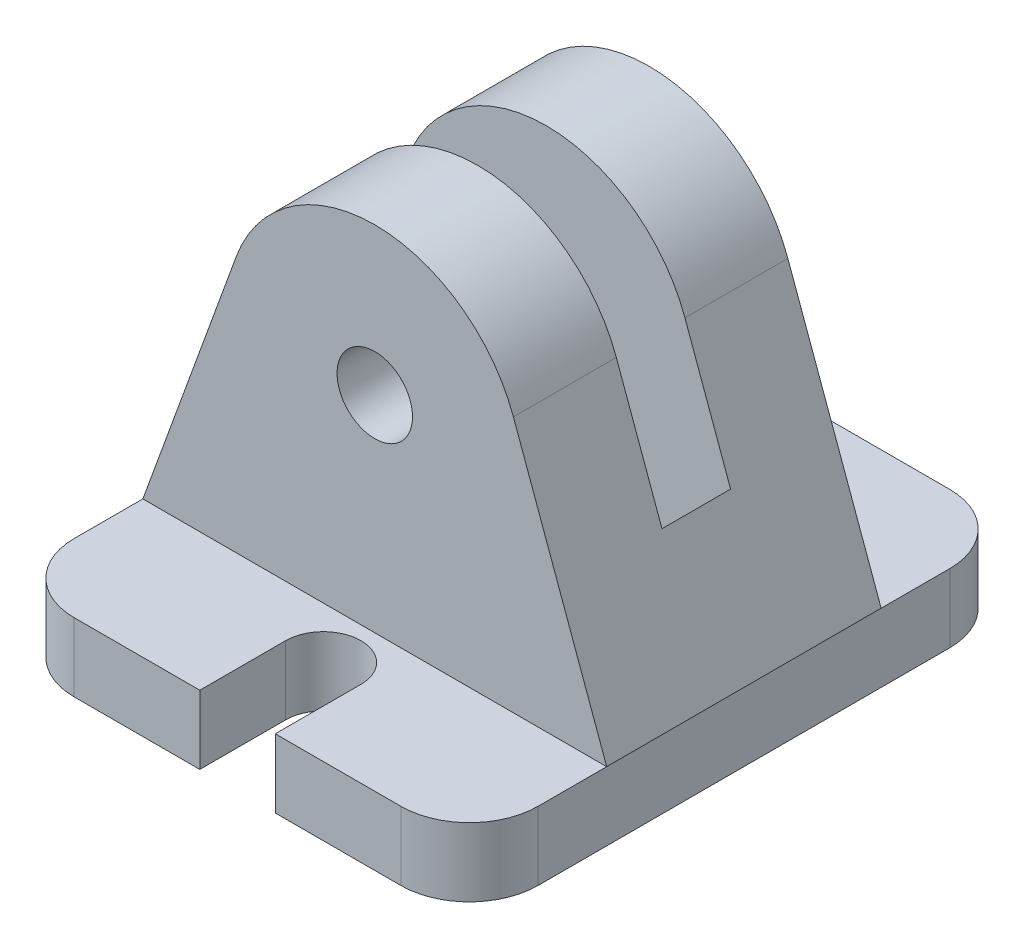
ISO-10303-21;
HEADER;
FILE_DESCRIPTION(('STEP AP214'),'2;1');
FILE_NAME('part.step','',(''),(''),'','','');
FILE_SCHEMA(('AUTOMOTIVE_DESIGN { 1 0 10303 214 1 1 1 1 }'));
ENDSEC;
DATA;
#1=APPLICATION_CONTEXT('core data for automotive mechanical design processes');
#2=APPLICATION_PROTOCOL_DEFINITION('international standard','automotive_design',2000,#1);
#3=PRODUCT_CONTEXT('',#1,'mechanical');
#4=PRODUCT('Part','Part','',(#3));
#5=PRODUCT_RELATED_PRODUCT_CATEGORY('part','',(#4));
#6=PRODUCT_DEFINITION_FORMATION('','',#4);
#7=PRODUCT_DEFINITION_CONTEXT('part definition',#1,'design');
#8=PRODUCT_DEFINITION('design','',#6,#7);
#9=PRODUCT_DEFINITION_SHAPE('','',#8);
#10=(LENGTH_UNIT() NAMED_UNIT(*) SI_UNIT(.MILLI.,.METRE.));
#11=(NAMED_UNIT(*) PLANE_ANGLE_UNIT() SI_UNIT($,.RADIAN.));
#12=(NAMED_UNIT(*) SI_UNIT($,.STERADIAN.) SOLID_ANGLE_UNIT());
#13=UNCERTAINTY_MEASURE_WITH_UNIT(LENGTH_MEASURE(1.E-05),#10,'distance_accuracy_value','');
#14=(GEOMETRIC_REPRESENTATION_CONTEXT(3) GLOBAL_UNCERTAINTY_ASSIGNED_CONTEXT((#13)) GLOBAL_UNIT_ASSIGNED_CONTEXT((#10,
#11,#12)) REPRESENTATION_CONTEXT('',''));
#15=CARTESIAN_POINT('',(0.,0.,0.));
#16=DIRECTION('',(0.,0.,1.));
#17=DIRECTION('',(1.,0.,0.));
#18=AXIS2_PLACEMENT_3D('',#15,#16,#17);
#19=CARTESIAN_POINT('',(0.,-20.,-20.));
#20=DIRECTION('',(0.,0.,1.));
#21=DIRECTION('',(1.,0.,0.));
#22=AXIS2_PLACEMENT_3D('',#19,#20,#21);
#23=PLANE('',#22);
#24=DIRECTION('',(1.,0.,0.));
#25=VECTOR('',#24,1.);
#26=CARTESIAN_POINT('',(0.,-20.,-20.));
#27=LINE('',#26,#25);
#28=CARTESIAN_POINT('',(2.75,-20.,-20.));
#29=VERTEX_POINT('',#28);
#30=CARTESIAN_POINT('',(11.8994645681091,-20.,-20.));
#31=VERTEX_POINT('',#30);
#32=EDGE_CURVE('E220',#29,#31,#27,.T.);
#33=ORIENTED_EDGE('',*,*,#32,.F.);
#34=DIRECTION('',(0.,-1.,0.));
#35=VECTOR('',#34,1.);
#36=CARTESIAN_POINT('',(2.75,10.75,-20.));
#37=LINE('',#36,#35);
#38=CARTESIAN_POINT('',(2.75,-15.,-20.));
#39=VERTEX_POINT('',#38);
#40=EDGE_CURVE('E211',#39,#29,#37,.T.);
#41=ORIENTED_EDGE('',*,*,#40,.F.);
#42=DIRECTION('',(1.,0.,0.));
#43=VECTOR('',#42,1.);
#44=CARTESIAN_POINT('',(0.,-15.,-20.));
#45=LINE('',#44,#43);
#46=CARTESIAN_POINT('',(11.8994645681091,-15.,-20.));
#47=VERTEX_POINT('',#46);
#48=EDGE_CURVE('E480',#39,#47,#45,.T.);
#49=ORIENTED_EDGE('',*,*,#48,.T.);
#50=DIRECTION('',(0.,1.,0.));
#51=VECTOR('',#50,1.);
#52=CARTESIAN_POINT('',(11.8994645681091,-20.,-20.));
#53=LINE('',#52,#51);
#54=EDGE_CURVE('E280',#31,#47,#53,.T.);
#55=ORIENTED_EDGE('',*,*,#54,.F.);
#56=EDGE_LOOP('',(#33,#41,#49,#55));
#57=FACE_BOUND('',#56,.T.);
#58=ADVANCED_FACE('F32',(#57),#23,.F.);
#59=CARTESIAN_POINT('',(0.,-20.,20.));
#60=DIRECTION('',(0.,0.,1.));
#61=DIRECTION('',(1.,0.,0.));
#62=AXIS2_PLACEMENT_3D('',#59,#60,#61);
#63=PLANE('',#62);
#64=DIRECTION('',(0.,-1.,0.));
#65=VECTOR('',#64,1.);
#66=CARTESIAN_POINT('',(2.75,10.75,20.));
#67=LINE('',#66,#65);
#68=CARTESIAN_POINT('',(2.75,-15.,20.));
#69=VERTEX_POINT('',#68);
#70=CARTESIAN_POINT('',(2.75,-20.,20.));
#71=VERTEX_POINT('',#70);
#72=EDGE_CURVE('E240',#69,#71,#67,.T.);
#73=ORIENTED_EDGE('',*,*,#72,.T.);
#74=DIRECTION('',(1.,0.,0.));
#75=VECTOR('',#74,1.);
#76=CARTESIAN_POINT('',(0.,-20.,20.));
#77=LINE('',#76,#75);
#78=CARTESIAN_POINT('',(11.8994645681091,-20.,20.));
#79=VERTEX_POINT('',#78);
#80=EDGE_CURVE('E231',#71,#79,#77,.T.);
#81=ORIENTED_EDGE('',*,*,#80,.T.);
#82=DIRECTION('',(0.,1.,0.));
#83=VECTOR('',#82,1.);
#84=CARTESIAN_POINT('',(11.8994645681091,-20.,20.));
#85=LINE('',#84,#83);
#86=CARTESIAN_POINT('',(11.8994645681091,-15.,20.));
#87=VERTEX_POINT('',#86);
#88=EDGE_CURVE('E271',#79,#87,#85,.T.);
#89=ORIENTED_EDGE('',*,*,#88,.T.);
#90=DIRECTION('',(1.,0.,0.));
#91=VECTOR('',#90,1.);
#92=CARTESIAN_POINT('',(0.,-15.,20.));
#93=LINE('',#92,#91);
#94=EDGE_CURVE('E265',#69,#87,#93,.T.);
#95=ORIENTED_EDGE('',*,*,#94,.F.);
#96=EDGE_LOOP('',(#73,#81,#89,#95));
#97=FACE_BOUND('',#96,.T.);
#98=ADVANCED_FACE('F457',(#97),#63,.T.);
#99=CARTESIAN_POINT('',(0.,0.,10.));
#100=DIRECTION('',(0.,0.,-1.));
#101=DIRECTION('',(-1.,0.,0.));
#102=AXIS2_PLACEMENT_3D('',#99,#100,#101);
#103=CYLINDRICAL_SURFACE('',#102,10.75);
#104=CARTESIAN_POINT('',(0.,0.,-2.5));
#105=DIRECTION('',(0.,0.,1.));
#106=DIRECTION('',(1.,0.,0.));
#107=AXIS2_PLACEMENT_3D('',#104,#105,#106);
#108=CIRCLE('',#107,10.75);
#109=CARTESIAN_POINT('',(10.1016956734485,3.67671654075095,-2.5));
#110=VERTEX_POINT('',#109);
#111=CARTESIAN_POINT('',(-10.1016956734485,3.67671654075095,-2.5));
#112=VERTEX_POINT('',#111);
#113=EDGE_CURVE('E314',#110,#112,#108,.T.);
#114=ORIENTED_EDGE('',*,*,#113,.F.);
#115=DIRECTION('',(0.,0.,-1.));
#116=VECTOR('',#115,1.);
#117=CARTESIAN_POINT('',(10.1016956734485,3.67671654075095,10.));
#118=LINE('',#117,#116);
#119=CARTESIAN_POINT('',(10.1016956734485,3.67671654075095,-10.));
#120=VERTEX_POINT('',#119);
#121=EDGE_CURVE('E352',#110,#120,#118,.T.);
#122=ORIENTED_EDGE('',*,*,#121,.T.);
#123=CARTESIAN_POINT('',(0.,0.,-10.));
#124=DIRECTION('',(0.,0.,1.));
#125=DIRECTION('',(1.,0.,0.));
#126=AXIS2_PLACEMENT_3D('',#123,#124,#125);
#127=CIRCLE('',#126,10.75);
#128=CARTESIAN_POINT('',(-10.1016956734485,3.67671654075095,-10.));
#129=VERTEX_POINT('',#128);
#130=EDGE_CURVE('E325',#120,#129,#127,.T.);
#131=ORIENTED_EDGE('',*,*,#130,.T.);
#132=DIRECTION('',(0.,0.,-1.));
#133=VECTOR('',#132,1.);
#134=CARTESIAN_POINT('',(-10.1016956734485,3.67671654075095,10.));
#135=LINE('',#134,#133);
#136=EDGE_CURVE('E360',#112,#129,#135,.T.);
#137=ORIENTED_EDGE('',*,*,#136,.F.);
#138=EDGE_LOOP('',(#114,#122,#131,#137));
#139=FACE_BOUND('',#138,.T.);
#140=ADVANCED_FACE('F498',(#139),#103,.T.);
#141=CARTESIAN_POINT('',(-10.1016956734485,3.67671654075095,10.));
#142=DIRECTION('',(0.939692620785908,-0.342020143325669,0.));
#143=DIRECTION('',(0.342020143325669,0.939692620785908,0.));
#144=AXIS2_PLACEMENT_3D('',#141,#142,#143);
#145=PLANE('',#144);
#146=DIRECTION('',(-0.342020143325669,-0.939692620785908,0.));
#147=VECTOR('',#146,1.);
#148=CARTESIAN_POINT('',(-10.1016956734485,3.67671654075095,-2.5));
#149=LINE('',#148,#147);
#150=CARTESIAN_POINT('',(-13.4298082611002,-5.46719764322487,-2.5));
#151=VERTEX_POINT('',#150);
#152=EDGE_CURVE('E316',#112,#151,#149,.T.);
#153=ORIENTED_EDGE('',*,*,#152,.F.);
#154=ORIENTED_EDGE('',*,*,#136,.T.);
#155=DIRECTION('',(-0.342020143325669,-0.939692620785908,0.));
#156=VECTOR('',#155,1.);
#157=CARTESIAN_POINT('',(-10.1016956734485,3.67671654075095,-10.));
#158=LINE('',#157,#156);
#159=CARTESIAN_POINT('',(-16.8994645681091,-15.,-10.));
#160=VERTEX_POINT('',#159);
#161=EDGE_CURVE('E363',#129,#160,#158,.T.);
#162=ORIENTED_EDGE('',*,*,#161,.T.);
#163=DIRECTION('',(0.,0.,-1.));
#164=VECTOR('',#163,1.);
#165=CARTESIAN_POINT('',(-16.8994645681091,-15.,10.));
#166=LINE('',#165,#164);
#167=CARTESIAN_POINT('',(-16.8994645681091,-15.,10.));
#168=VERTEX_POINT('',#167);
#169=EDGE_CURVE('E347',#168,#160,#166,.T.);
#170=ORIENTED_EDGE('',*,*,#169,.F.);
#171=DIRECTION('',(-0.342020143325669,-0.939692620785908,0.));
#172=VECTOR('',#171,1.);
#173=CARTESIAN_POINT('',(-10.1016956734485,3.67671654075095,10.));
#174=LINE('',#173,#172);
#175=CARTESIAN_POINT('',(-10.1016956734485,3.67671654075095,10.));
#176=VERTEX_POINT('',#175);
#177=EDGE_CURVE('E331',#176,#168,#174,.T.);
#178=ORIENTED_EDGE('',*,*,#177,.F.);
#179=CARTESIAN_POINT('',(-10.1016956734485,3.67671654075095,2.5));
#180=VERTEX_POINT('',#179);
#181=EDGE_CURVE('E375',#176,#180,#135,.T.);
#182=ORIENTED_EDGE('',*,*,#181,.T.);
#183=DIRECTION('',(-0.342020143325669,-0.939692620785908,0.));
#184=VECTOR('',#183,1.);
#185=CARTESIAN_POINT('',(-10.1016956734485,3.67671654075095,2.5));
#186=LINE('',#185,#184);
#187=CARTESIAN_POINT('',(-13.4298082611002,-5.46719764322487,2.5));
#188=VERTEX_POINT('',#187);
#189=EDGE_CURVE('E308',#180,#188,#186,.T.);
#190=ORIENTED_EDGE('',*,*,#189,.T.);
#191=DIRECTION('',(0.,0.,1.));
#192=VECTOR('',#191,1.);
#193=CARTESIAN_POINT('',(-13.4298082611002,-5.46719764322487,-2.5));
#194=LINE('',#193,#192);
#195=EDGE_CURVE('E318',#188,#151,#194,.F.);
#196=ORIENTED_EDGE('',*,*,#195,.T.);
#197=EDGE_LOOP('',(#153,#154,#162,#170,#178,#182,#190,#196));
#198=FACE_BOUND('',#197,.T.);
#199=ADVANCED_FACE('F396',(#198),#145,.F.);
#200=CARTESIAN_POINT('',(16.8994645681091,-15.,10.));
#201=DIRECTION('',(-0.939692620785908,-0.34202014332567,0.));
#202=DIRECTION('',(0.34202014332567,-0.939692620785908,0.));
#203=AXIS2_PLACEMENT_3D('',#200,#201,#202);
#204=PLANE('',#203);
#205=DIRECTION('',(-0.34202014332567,0.939692620785908,0.));
#206=VECTOR('',#205,1.);
#207=CARTESIAN_POINT('',(16.8994645681091,-15.,-2.5));
#208=LINE('',#207,#206);
#209=CARTESIAN_POINT('',(13.4298082611003,-5.46719764322486,-2.5));
#210=VERTEX_POINT('',#209);
#211=EDGE_CURVE('E312',#210,#110,#208,.T.);
#212=ORIENTED_EDGE('',*,*,#211,.F.);
#213=DIRECTION('',(0.,0.,1.));
#214=VECTOR('',#213,1.);
#215=CARTESIAN_POINT('',(13.4298082611003,-5.46719764322486,-2.5));
#216=LINE('',#215,#214);
#217=CARTESIAN_POINT('',(13.4298082611003,-5.46719764322486,2.5));
#218=VERTEX_POINT('',#217);
#219=EDGE_CURVE('E342',#210,#218,#216,.T.);
#220=ORIENTED_EDGE('',*,*,#219,.T.);
#221=DIRECTION('',(-0.34202014332567,0.939692620785908,0.));
#222=VECTOR('',#221,1.);
#223=CARTESIAN_POINT('',(16.8994645681091,-15.,2.5));
#224=LINE('',#223,#222);
#225=CARTESIAN_POINT('',(10.1016956734485,3.67671654075095,2.5));
#226=VERTEX_POINT('',#225);
#227=EDGE_CURVE('E302',#218,#226,#224,.T.);
#228=ORIENTED_EDGE('',*,*,#227,.T.);
#229=CARTESIAN_POINT('',(10.1016956734485,3.67671654075095,10.));
#230=VERTEX_POINT('',#229);
#231=EDGE_CURVE('E348',#230,#226,#118,.T.);
#232=ORIENTED_EDGE('',*,*,#231,.F.);
#233=DIRECTION('',(-0.34202014332567,0.939692620785908,0.));
#234=VECTOR('',#233,1.);
#235=CARTESIAN_POINT('',(16.8994645681091,-15.,10.));
#236=LINE('',#235,#234);
#237=CARTESIAN_POINT('',(16.8994645681091,-15.,10.));
#238=VERTEX_POINT('',#237);
#239=EDGE_CURVE('E341',#238,#230,#236,.T.);
#240=ORIENTED_EDGE('',*,*,#239,.F.);
#241=DIRECTION('',(0.,0.,-1.));
#242=VECTOR('',#241,1.);
#243=CARTESIAN_POINT('',(16.8994645681091,-15.,10.));
#244=LINE('',#243,#242);
#245=CARTESIAN_POINT('',(16.8994645681091,-15.,-10.));
#246=VERTEX_POINT('',#245);
#247=EDGE_CURVE('E344',#238,#246,#244,.T.);
#248=ORIENTED_EDGE('',*,*,#247,.T.);
#249=DIRECTION('',(-0.34202014332567,0.939692620785908,0.));
#250=VECTOR('',#249,1.);
#251=CARTESIAN_POINT('',(16.8994645681091,-15.,-10.));
#252=LINE('',#251,#250);
#253=EDGE_CURVE('E332',#246,#120,#252,.T.);
#254=ORIENTED_EDGE('',*,*,#253,.T.);
#255=ORIENTED_EDGE('',*,*,#121,.F.);
#256=EDGE_LOOP('',(#212,#220,#228,#232,#240,#248,#254,#255));
#257=FACE_BOUND('',#256,.T.);
#258=ADVANCED_FACE('F404',(#257),#204,.F.);
#259=CARTESIAN_POINT('',(0.,0.,10.));
#260=DIRECTION('',(0.,0.,-1.));
#261=DIRECTION('',(-1.,0.,0.));
#262=AXIS2_PLACEMENT_3D('',#259,#260,#261);
#263=CYLINDRICAL_SURFACE('',#262,2.75);
#264=CARTESIAN_POINT('',(0.,0.,-10.));
#265=DIRECTION('',(0.,0.,1.));
#266=DIRECTION('',(1.,0.,0.));
#267=AXIS2_PLACEMENT_3D('',#264,#265,#266);
#268=CIRCLE('',#267,2.75);
#269=CARTESIAN_POINT('',(2.75,0.,-10.));
#270=VERTEX_POINT('',#269);
#271=EDGE_CURVE('E321',#270,#270,#268,.T.);
#272=ORIENTED_EDGE('',*,*,#271,.F.);
#273=EDGE_LOOP('',(#272));
#274=FACE_BOUND('',#273,.T.);
#275=CARTESIAN_POINT('',(0.,0.,-2.5));
#276=DIRECTION('',(0.,0.,1.));
#277=DIRECTION('',(1.,0.,0.));
#278=AXIS2_PLACEMENT_3D('',#275,#276,#277);
#279=CIRCLE('',#278,2.75);
#280=CARTESIAN_POINT('',(2.75,0.,-2.5));
#281=VERTEX_POINT('',#280);
#282=EDGE_CURVE('E311',#281,#281,#279,.T.);
#283=ORIENTED_EDGE('',*,*,#282,.T.);
#284=EDGE_LOOP('',(#283));
#285=FACE_BOUND('',#284,.T.);
#286=ADVANCED_FACE('F382',(#274,#285),#263,.F.);
#287=CARTESIAN_POINT('',(0.,0.,10.));
#288=DIRECTION('',(0.,0.,1.));
#289=DIRECTION('',(1.,0.,0.));
#290=AXIS2_PLACEMENT_3D('',#287,#288,#289);
#291=PLANE('',#290);
#292=CARTESIAN_POINT('',(0.,0.,10.));
#293=DIRECTION('',(0.,0.,1.));
#294=DIRECTION('',(1.,0.,0.));
#295=AXIS2_PLACEMENT_3D('',#292,#293,#294);
#296=CIRCLE('',#295,10.75);
#297=EDGE_CURVE('E328',#230,#176,#296,.T.);
#298=ORIENTED_EDGE('',*,*,#297,.T.);
#299=ORIENTED_EDGE('',*,*,#177,.T.);
#300=DIRECTION('',(1.,0.,0.));
#301=VECTOR('',#300,1.);
#302=CARTESIAN_POINT('',(-16.8994645681091,-15.,10.));
#303=LINE('',#302,#301);
#304=EDGE_CURVE('E337',#168,#238,#303,.T.);
#305=ORIENTED_EDGE('',*,*,#304,.T.);
#306=ORIENTED_EDGE('',*,*,#239,.T.);
#307=EDGE_LOOP('',(#298,#299,#305,#306));
#308=FACE_BOUND('',#307,.T.);
#309=CARTESIAN_POINT('',(0.,0.,10.));
#310=DIRECTION('',(0.,0.,1.));
#311=DIRECTION('',(1.,0.,0.));
#312=AXIS2_PLACEMENT_3D('',#309,#310,#311);
#313=CIRCLE('',#312,2.75);
#314=CARTESIAN_POINT('',(2.75,0.,10.));
#315=VERTEX_POINT('',#314);
#316=EDGE_CURVE('E322',#315,#315,#313,.T.);
#317=ORIENTED_EDGE('',*,*,#316,.F.);
#318=EDGE_LOOP('',(#317));
#319=FACE_BOUND('',#318,.T.);
#320=ADVANCED_FACE('F468',(#308,#319),#291,.T.);
#321=CARTESIAN_POINT('',(0.,0.,-10.));
#322=DIRECTION('',(0.,0.,1.));
#323=DIRECTION('',(1.,0.,0.));
#324=AXIS2_PLACEMENT_3D('',#321,#322,#323);
#325=PLANE('',#324);
#326=ORIENTED_EDGE('',*,*,#130,.F.);
#327=ORIENTED_EDGE('',*,*,#253,.F.);
#328=DIRECTION('',(1.,0.,0.));
#329=VECTOR('',#328,1.);
#330=CARTESIAN_POINT('',(-16.8994645681091,-15.,-10.));
#331=LINE('',#330,#329);
#332=EDGE_CURVE('E366',#160,#246,#331,.T.);
#333=ORIENTED_EDGE('',*,*,#332,.F.);
#334=ORIENTED_EDGE('',*,*,#161,.F.);
#335=EDGE_LOOP('',(#326,#327,#333,#334));
#336=FACE_BOUND('',#335,.T.);
#337=ORIENTED_EDGE('',*,*,#271,.T.);
#338=EDGE_LOOP('',(#337));
#339=FACE_BOUND('',#338,.T.);
#340=ADVANCED_FACE('F494',(#336,#339),#325,.F.);
#341=ORIENTED_EDGE('',*,*,#231,.T.);
#342=CARTESIAN_POINT('',(0.,0.,2.5));
#343=DIRECTION('',(0.,0.,1.));
#344=DIRECTION('',(1.,0.,0.));
#345=AXIS2_PLACEMENT_3D('',#342,#343,#344);
#346=CIRCLE('',#345,10.75);
#347=EDGE_CURVE('E305',#226,#180,#346,.T.);
#348=ORIENTED_EDGE('',*,*,#347,.T.);
#349=ORIENTED_EDGE('',*,*,#181,.F.);
#350=ORIENTED_EDGE('',*,*,#297,.F.);
#351=EDGE_LOOP('',(#341,#348,#349,#350));
#352=FACE_BOUND('',#351,.T.);
#353=ADVANCED_FACE('F34',(#352),#103,.T.);
#354=CARTESIAN_POINT('',(0.,0.,2.5));
#355=DIRECTION('',(0.,0.,1.));
#356=DIRECTION('',(1.,0.,0.));
#357=AXIS2_PLACEMENT_3D('',#354,#355,#356);
#358=CIRCLE('',#357,2.75);
#359=CARTESIAN_POINT('',(2.75,0.,2.5));
#360=VERTEX_POINT('',#359);
#361=EDGE_CURVE('E300',#360,#360,#358,.T.);
#362=ORIENTED_EDGE('',*,*,#361,.F.);
#363=EDGE_LOOP('',(#362));
#364=FACE_BOUND('',#363,.T.);
#365=ORIENTED_EDGE('',*,*,#316,.T.);
#366=EDGE_LOOP('',(#365));
#367=FACE_BOUND('',#366,.T.);
#368=ADVANCED_FACE('F506',(#364,#367),#263,.F.);
#369=CARTESIAN_POINT('',(0.,0.,-2.5));
#370=DIRECTION('',(0.,0.,1.));
#371=DIRECTION('',(1.,0.,0.));
#372=AXIS2_PLACEMENT_3D('',#369,#370,#371);
#373=CYLINDRICAL_SURFACE('',#372,14.5);
#374=CARTESIAN_POINT('',(0.,0.,2.5));
#375=DIRECTION('',(0.,0.,1.));
#376=DIRECTION('',(1.,0.,0.));
#377=AXIS2_PLACEMENT_3D('',#374,#375,#376);
#378=CIRCLE('',#377,14.5);
#379=EDGE_CURVE('E288',#188,#218,#378,.T.);
#380=ORIENTED_EDGE('',*,*,#379,.T.);
#381=ORIENTED_EDGE('',*,*,#219,.F.);
#382=CARTESIAN_POINT('',(0.,0.,-2.5));
#383=DIRECTION('',(0.,0.,1.));
#384=DIRECTION('',(1.,0.,0.));
#385=AXIS2_PLACEMENT_3D('',#382,#383,#384);
#386=CIRCLE('',#385,14.5);
#387=EDGE_CURVE('E294',#151,#210,#386,.T.);
#388=ORIENTED_EDGE('',*,*,#387,.F.);
#389=ORIENTED_EDGE('',*,*,#195,.F.);
#390=EDGE_LOOP('',(#380,#381,#388,#389));
#391=FACE_BOUND('',#390,.T.);
#392=ADVANCED_FACE('F388',(#391),#373,.F.);
#393=CARTESIAN_POINT('',(0.,0.,-2.5));
#394=DIRECTION('',(0.,0.,1.));
#395=DIRECTION('',(1.,0.,0.));
#396=AXIS2_PLACEMENT_3D('',#393,#394,#395);
#397=PLANE('',#396);
#398=ORIENTED_EDGE('',*,*,#282,.F.);
#399=EDGE_LOOP('',(#398));
#400=FACE_BOUND('',#399,.T.);
#401=ORIENTED_EDGE('',*,*,#152,.T.);
#402=ORIENTED_EDGE('',*,*,#387,.T.);
#403=ORIENTED_EDGE('',*,*,#211,.T.);
#404=ORIENTED_EDGE('',*,*,#113,.T.);
#405=EDGE_LOOP('',(#401,#402,#403,#404));
#406=FACE_BOUND('',#405,.T.);
#407=ADVANCED_FACE('F384',(#400,#406),#397,.T.);
#408=CARTESIAN_POINT('',(0.,0.,2.5));
#409=DIRECTION('',(0.,0.,1.));
#410=DIRECTION('',(1.,0.,0.));
#411=AXIS2_PLACEMENT_3D('',#408,#409,#410);
#412=PLANE('',#411);
#413=ORIENTED_EDGE('',*,*,#361,.T.);
#414=EDGE_LOOP('',(#413));
#415=FACE_BOUND('',#414,.T.);
#416=ORIENTED_EDGE('',*,*,#347,.F.);
#417=ORIENTED_EDGE('',*,*,#227,.F.);
#418=ORIENTED_EDGE('',*,*,#379,.F.);
#419=ORIENTED_EDGE('',*,*,#189,.F.);
#420=EDGE_LOOP('',(#416,#417,#418,#419));
#421=FACE_BOUND('',#420,.T.);
#422=ADVANCED_FACE('F387',(#415,#421),#412,.F.);
#423=CARTESIAN_POINT('',(0.,-15.,0.));
#424=DIRECTION('',(0.,-1.,0.));
#425=DIRECTION('',(1.,0.,0.));
#426=AXIS2_PLACEMENT_3D('',#423,#424,#425);
#427=PLANE('',#426);
#428=ORIENTED_EDGE('',*,*,#48,.F.);
#429=DIRECTION('',(0.,0.,1.));
#430=VECTOR('',#429,1.);
#431=CARTESIAN_POINT('',(2.75,-15.,0.));
#432=LINE('',#431,#430);
#433=CARTESIAN_POINT('',(2.75,-15.,-13.75));
#434=VERTEX_POINT('',#433);
#435=EDGE_CURVE('E451',#39,#434,#432,.T.);
#436=ORIENTED_EDGE('',*,*,#435,.T.);
#437=CARTESIAN_POINT('',(0.,-15.,-13.75));
#438=DIRECTION('',(0.,-1.,0.));
#439=DIRECTION('',(1.,0.,0.));
#440=AXIS2_PLACEMENT_3D('',#437,#438,#439);
#441=CIRCLE('',#440,2.75);
#442=CARTESIAN_POINT('',(-2.75,-15.,-13.75));
#443=VERTEX_POINT('',#442);
#444=EDGE_CURVE('E447',#434,#443,#441,.T.);
#445=ORIENTED_EDGE('',*,*,#444,.T.);
#446=DIRECTION('',(0.,0.,-1.));
#447=VECTOR('',#446,1.);
#448=CARTESIAN_POINT('',(-2.75,-15.,0.));
#449=LINE('',#448,#447);
#450=CARTESIAN_POINT('',(-2.75,-15.,-20.));
#451=VERTEX_POINT('',#450);
#452=EDGE_CURVE('E737',#443,#451,#449,.T.);
#453=ORIENTED_EDGE('',*,*,#452,.T.);
#454=CARTESIAN_POINT('',(-11.8994645681091,-15.,-20.));
#455=VERTEX_POINT('',#454);
#456=EDGE_CURVE('E210',#455,#451,#45,.T.);
#457=ORIENTED_EDGE('',*,*,#456,.F.);
#458=CARTESIAN_POINT('',(-11.8994645681091,-15.,-15.));
#459=DIRECTION('',(0.,-1.,0.));
#460=DIRECTION('',(1.,0.,0.));
#461=AXIS2_PLACEMENT_3D('',#458,#459,#460);
#462=CIRCLE('',#461,5.);
#463=CARTESIAN_POINT('',(-16.8994645681091,-15.,-15.));
#464=VERTEX_POINT('',#463);
#465=EDGE_CURVE('E243',#464,#455,#462,.T.);
#466=ORIENTED_EDGE('',*,*,#465,.F.);
#467=DIRECTION('',(0.,0.,1.));
#468=VECTOR('',#467,1.);
#469=CARTESIAN_POINT('',(-16.8994645681091,-15.,0.));
#470=LINE('',#469,#468);
#471=EDGE_CURVE('E249',#464,#160,#470,.T.);
#472=ORIENTED_EDGE('',*,*,#471,.T.);
#473=ORIENTED_EDGE('',*,*,#332,.T.);
#474=DIRECTION('',(0.,0.,1.));
#475=VECTOR('',#474,1.);
#476=CARTESIAN_POINT('',(16.8994645681091,-15.,0.));
#477=LINE('',#476,#475);
#478=CARTESIAN_POINT('',(16.8994645681091,-15.,-15.));
#479=VERTEX_POINT('',#478);
#480=EDGE_CURVE('E255',#479,#246,#477,.T.);
#481=ORIENTED_EDGE('',*,*,#480,.F.);
#482=CARTESIAN_POINT('',(11.8994645681091,-15.,-15.));
#483=DIRECTION('',(0.,-1.,0.));
#484=DIRECTION('',(1.,0.,0.));
#485=AXIS2_PLACEMENT_3D('',#482,#483,#484);
#486=CIRCLE('',#485,5.);
#487=EDGE_CURVE('E256',#47,#479,#486,.T.);
#488=ORIENTED_EDGE('',*,*,#487,.F.);
#489=EDGE_LOOP('',(#428,#436,#445,#453,#457,#466,#472,#473,#481,#488));
#490=FACE_BOUND('',#489,.T.);
#491=ADVANCED_FACE('F476',(#490),#427,.F.);
#492=CARTESIAN_POINT('',(-11.8994645681091,-20.,15.));
#493=DIRECTION('',(0.,1.,0.));
#494=DIRECTION('',(-1.,0.,0.));
#495=AXIS2_PLACEMENT_3D('',#492,#493,#494);
#496=CYLINDRICAL_SURFACE('',#495,5.);
#497=CARTESIAN_POINT('',(-11.8994645681091,-15.,15.));
#498=DIRECTION('',(0.,-1.,0.));
#499=DIRECTION('',(1.,0.,0.));
#500=AXIS2_PLACEMENT_3D('',#497,#498,#499);
#501=CIRCLE('',#500,5.);
#502=CARTESIAN_POINT('',(-16.8994645681091,-15.,15.));
#503=VERTEX_POINT('',#502);
#504=CARTESIAN_POINT('',(-11.8994645681091,-15.,20.));
#505=VERTEX_POINT('',#504);
#506=EDGE_CURVE('E236',#503,#505,#501,.F.);
#507=ORIENTED_EDGE('',*,*,#506,.F.);
#508=DIRECTION('',(0.,1.,0.));
#509=VECTOR('',#508,1.);
#510=CARTESIAN_POINT('',(-16.8994645681091,-20.,15.));
#511=LINE('',#510,#509);
#512=CARTESIAN_POINT('',(-16.8994645681091,-20.,15.));
#513=VERTEX_POINT('',#512);
#514=EDGE_CURVE('E286',#513,#503,#511,.T.);
#515=ORIENTED_EDGE('',*,*,#514,.F.);
#516=CARTESIAN_POINT('',(-11.8994645681091,-20.,15.));
#517=DIRECTION('',(0.,-1.,0.));
#518=DIRECTION('',(1.,0.,0.));
#519=AXIS2_PLACEMENT_3D('',#516,#517,#518);
#520=CIRCLE('',#519,5.);
#521=CARTESIAN_POINT('',(-11.8994645681091,-20.,20.));
#522=VERTEX_POINT('',#521);
#523=EDGE_CURVE('E269',#513,#522,#520,.F.);
#524=ORIENTED_EDGE('',*,*,#523,.T.);
#525=DIRECTION('',(0.,1.,0.));
#526=VECTOR('',#525,1.);
#527=CARTESIAN_POINT('',(-11.8994645681091,-20.,20.));
#528=LINE('',#527,#526);
#529=EDGE_CURVE('E235',#522,#505,#528,.T.);
#530=ORIENTED_EDGE('',*,*,#529,.T.);
#531=EDGE_LOOP('',(#507,#515,#524,#530));
#532=FACE_BOUND('',#531,.T.);
#533=ADVANCED_FACE('F440',(#532),#496,.T.);
#534=CARTESIAN_POINT('',(-16.8994645681091,-20.,0.));
#535=DIRECTION('',(-1.,0.,0.));
#536=DIRECTION('',(0.,-1.,0.));
#537=AXIS2_PLACEMENT_3D('',#534,#535,#536);
#538=PLANE('',#537);
#539=ORIENTED_EDGE('',*,*,#471,.F.);
#540=DIRECTION('',(0.,1.,0.));
#541=VECTOR('',#540,1.);
#542=CARTESIAN_POINT('',(-16.8994645681091,-20.,-15.));
#543=LINE('',#542,#541);
#544=CARTESIAN_POINT('',(-16.8994645681091,-20.,-15.));
#545=VERTEX_POINT('',#544);
#546=EDGE_CURVE('E285',#545,#464,#543,.T.);
#547=ORIENTED_EDGE('',*,*,#546,.F.);
#548=DIRECTION('',(0.,0.,1.));
#549=VECTOR('',#548,1.);
#550=CARTESIAN_POINT('',(-16.8994645681091,-20.,0.));
#551=LINE('',#550,#549);
#552=EDGE_CURVE('E433',#545,#513,#551,.T.);
#553=ORIENTED_EDGE('',*,*,#552,.T.);
#554=ORIENTED_EDGE('',*,*,#514,.T.);
#555=EDGE_CURVE('E239',#168,#503,#470,.T.);
#556=ORIENTED_EDGE('',*,*,#555,.F.);
#557=ORIENTED_EDGE('',*,*,#169,.T.);
#558=EDGE_LOOP('',(#539,#547,#553,#554,#556,#557));
#559=FACE_BOUND('',#558,.T.);
#560=ADVANCED_FACE('F435',(#559),#538,.T.);
#561=CARTESIAN_POINT('',(-11.8994645681091,-20.,-15.));
#562=DIRECTION('',(0.,1.,0.));
#563=DIRECTION('',(-1.,0.,0.));
#564=AXIS2_PLACEMENT_3D('',#561,#562,#563);
#565=CYLINDRICAL_SURFACE('',#564,5.);
#566=ORIENTED_EDGE('',*,*,#465,.T.);
#567=DIRECTION('',(0.,1.,0.));
#568=VECTOR('',#567,1.);
#569=CARTESIAN_POINT('',(-11.8994645681091,-20.,-20.));
#570=LINE('',#569,#568);
#571=CARTESIAN_POINT('',(-11.8994645681091,-20.,-20.));
#572=VERTEX_POINT('',#571);
#573=EDGE_CURVE('E283',#572,#455,#570,.T.);
#574=ORIENTED_EDGE('',*,*,#573,.F.);
#575=CARTESIAN_POINT('',(-11.8994645681091,-20.,-15.));
#576=DIRECTION('',(0.,-1.,0.));
#577=DIRECTION('',(1.,0.,0.));
#578=AXIS2_PLACEMENT_3D('',#575,#576,#577);
#579=CIRCLE('',#578,5.);
#580=EDGE_CURVE('E217',#545,#572,#579,.T.);
#581=ORIENTED_EDGE('',*,*,#580,.F.);
#582=ORIENTED_EDGE('',*,*,#546,.T.);
#583=EDGE_LOOP('',(#566,#574,#581,#582));
#584=FACE_BOUND('',#583,.T.);
#585=ADVANCED_FACE('F515',(#584),#565,.T.);
#586=ORIENTED_EDGE('',*,*,#456,.T.);
#587=DIRECTION('',(0.,-1.,0.));
#588=VECTOR('',#587,1.);
#589=CARTESIAN_POINT('',(-2.75,10.75,-20.));
#590=LINE('',#589,#588);
#591=CARTESIAN_POINT('',(-2.75,-20.,-20.));
#592=VERTEX_POINT('',#591);
#593=EDGE_CURVE('E196',#451,#592,#590,.T.);
#594=ORIENTED_EDGE('',*,*,#593,.T.);
#595=EDGE_CURVE('E208',#572,#592,#27,.T.);
#596=ORIENTED_EDGE('',*,*,#595,.F.);
#597=ORIENTED_EDGE('',*,*,#573,.T.);
#598=EDGE_LOOP('',(#586,#594,#596,#597));
#599=FACE_BOUND('',#598,.T.);
#600=ADVANCED_FACE('F206',(#599),#23,.F.);
#601=CARTESIAN_POINT('',(11.8994645681091,-20.,-15.));
#602=DIRECTION('',(0.,1.,0.));
#603=DIRECTION('',(-1.,0.,0.));
#604=AXIS2_PLACEMENT_3D('',#601,#602,#603);
#605=CYLINDRICAL_SURFACE('',#604,5.);
#606=ORIENTED_EDGE('',*,*,#487,.T.);
#607=DIRECTION('',(0.,1.,0.));
#608=VECTOR('',#607,1.);
#609=CARTESIAN_POINT('',(16.8994645681091,-20.,-15.));
#610=LINE('',#609,#608);
#611=CARTESIAN_POINT('',(16.8994645681091,-20.,-15.));
#612=VERTEX_POINT('',#611);
#613=EDGE_CURVE('E277',#612,#479,#610,.T.);
#614=ORIENTED_EDGE('',*,*,#613,.F.);
#615=CARTESIAN_POINT('',(11.8994645681091,-20.,-15.));
#616=DIRECTION('',(0.,-1.,0.));
#617=DIRECTION('',(1.,0.,0.));
#618=AXIS2_PLACEMENT_3D('',#615,#616,#617);
#619=CIRCLE('',#618,5.);
#620=EDGE_CURVE('E219',#31,#612,#619,.T.);
#621=ORIENTED_EDGE('',*,*,#620,.F.);
#622=ORIENTED_EDGE('',*,*,#54,.T.);
#623=EDGE_LOOP('',(#606,#614,#621,#622));
#624=FACE_BOUND('',#623,.T.);
#625=ADVANCED_FACE('F487',(#624),#605,.T.);
#626=CARTESIAN_POINT('',(16.8994645681091,-20.,0.));
#627=DIRECTION('',(-1.,0.,0.));
#628=DIRECTION('',(0.,-1.,0.));
#629=AXIS2_PLACEMENT_3D('',#626,#627,#628);
#630=PLANE('',#629);
#631=ORIENTED_EDGE('',*,*,#480,.T.);
#632=ORIENTED_EDGE('',*,*,#247,.F.);
#633=CARTESIAN_POINT('',(16.8994645681091,-15.,15.));
#634=VERTEX_POINT('',#633);
#635=EDGE_CURVE('E252',#238,#634,#477,.T.);
#636=ORIENTED_EDGE('',*,*,#635,.T.);
#637=DIRECTION('',(0.,1.,0.));
#638=VECTOR('',#637,1.);
#639=CARTESIAN_POINT('',(16.8994645681091,-20.,15.));
#640=LINE('',#639,#638);
#641=CARTESIAN_POINT('',(16.8994645681091,-20.,15.));
#642=VERTEX_POINT('',#641);
#643=EDGE_CURVE('E274',#642,#634,#640,.T.);
#644=ORIENTED_EDGE('',*,*,#643,.F.);
#645=DIRECTION('',(0.,0.,1.));
#646=VECTOR('',#645,1.);
#647=CARTESIAN_POINT('',(16.8994645681091,-20.,0.));
#648=LINE('',#647,#646);
#649=EDGE_CURVE('E222',#612,#642,#648,.T.);
#650=ORIENTED_EDGE('',*,*,#649,.F.);
#651=ORIENTED_EDGE('',*,*,#613,.T.);
#652=EDGE_LOOP('',(#631,#632,#636,#644,#650,#651));
#653=FACE_BOUND('',#652,.T.);
#654=ADVANCED_FACE('F489',(#653),#630,.F.);
#655=CARTESIAN_POINT('',(11.8994645681091,-20.,15.));
#656=DIRECTION('',(0.,1.,0.));
#657=DIRECTION('',(-1.,0.,0.));
#658=AXIS2_PLACEMENT_3D('',#655,#656,#657);
#659=CYLINDRICAL_SURFACE('',#658,5.);
#660=CARTESIAN_POINT('',(11.8994645681091,-15.,15.));
#661=DIRECTION('',(0.,-1.,0.));
#662=DIRECTION('',(1.,0.,0.));
#663=AXIS2_PLACEMENT_3D('',#660,#661,#662);
#664=CIRCLE('',#663,5.);
#665=EDGE_CURVE('E261',#87,#634,#664,.F.);
#666=ORIENTED_EDGE('',*,*,#665,.F.);
#667=ORIENTED_EDGE('',*,*,#88,.F.);
#668=CARTESIAN_POINT('',(11.8994645681091,-20.,15.));
#669=DIRECTION('',(0.,-1.,0.));
#670=DIRECTION('',(1.,0.,0.));
#671=AXIS2_PLACEMENT_3D('',#668,#669,#670);
#672=CIRCLE('',#671,5.);
#673=EDGE_CURVE('E228',#79,#642,#672,.F.);
#674=ORIENTED_EDGE('',*,*,#673,.T.);
#675=ORIENTED_EDGE('',*,*,#643,.T.);
#676=EDGE_LOOP('',(#666,#667,#674,#675));
#677=FACE_BOUND('',#676,.T.);
#678=ADVANCED_FACE('F464',(#677),#659,.T.);
#679=DIRECTION('',(0.,-1.,0.));
#680=VECTOR('',#679,1.);
#681=CARTESIAN_POINT('',(-2.75,10.75,20.));
#682=LINE('',#681,#680);
#683=CARTESIAN_POINT('',(-2.75,-15.,20.));
#684=VERTEX_POINT('',#683);
#685=CARTESIAN_POINT('',(-2.75,-20.,20.));
#686=VERTEX_POINT('',#685);
#687=EDGE_CURVE('E426',#684,#686,#682,.T.);
#688=ORIENTED_EDGE('',*,*,#687,.F.);
#689=EDGE_CURVE('E266',#505,#684,#93,.T.);
#690=ORIENTED_EDGE('',*,*,#689,.F.);
#691=ORIENTED_EDGE('',*,*,#529,.F.);
#692=EDGE_CURVE('E232',#522,#686,#77,.T.);
#693=ORIENTED_EDGE('',*,*,#692,.T.);
#694=EDGE_LOOP('',(#688,#690,#691,#693));
#695=FACE_BOUND('',#694,.T.);
#696=ADVANCED_FACE('F444',(#695),#63,.T.);
#697=CARTESIAN_POINT('',(0.,-20.,0.));
#698=DIRECTION('',(0.,-1.,0.));
#699=DIRECTION('',(1.,0.,0.));
#700=AXIS2_PLACEMENT_3D('',#697,#698,#699);
#701=PLANE('',#700);
#702=DIRECTION('',(0.,0.,1.));
#703=VECTOR('',#702,1.);
#704=CARTESIAN_POINT('',(2.75,-20.,-13.75));
#705=LINE('',#704,#703);
#706=CARTESIAN_POINT('',(2.75,-20.,-13.75));
#707=VERTEX_POINT('',#706);
#708=EDGE_CURVE('E201',#29,#707,#705,.T.);
#709=ORIENTED_EDGE('',*,*,#708,.F.);
#710=ORIENTED_EDGE('',*,*,#32,.T.);
#711=ORIENTED_EDGE('',*,*,#620,.T.);
#712=ORIENTED_EDGE('',*,*,#649,.T.);
#713=ORIENTED_EDGE('',*,*,#673,.F.);
#714=ORIENTED_EDGE('',*,*,#80,.F.);
#715=DIRECTION('',(0.,0.,1.));
#716=VECTOR('',#715,1.);
#717=CARTESIAN_POINT('',(2.75,-20.,13.75));
#718=LINE('',#717,#716);
#719=CARTESIAN_POINT('',(2.75,-20.,13.75));
#720=VERTEX_POINT('',#719);
#721=EDGE_CURVE('E431',#720,#71,#718,.T.);
#722=ORIENTED_EDGE('',*,*,#721,.F.);
#723=CARTESIAN_POINT('',(0.,-20.,13.75));
#724=DIRECTION('',(0.,-1.,0.));
#725=DIRECTION('',(1.,0.,0.));
#726=AXIS2_PLACEMENT_3D('',#723,#724,#725);
#727=CIRCLE('',#726,2.75);
#728=CARTESIAN_POINT('',(-2.75,-20.,13.75));
#729=VERTEX_POINT('',#728);
#730=EDGE_CURVE('E420',#729,#720,#727,.T.);
#731=ORIENTED_EDGE('',*,*,#730,.F.);
#732=DIRECTION('',(0.,0.,-1.));
#733=VECTOR('',#732,1.);
#734=CARTESIAN_POINT('',(-2.75,-20.,20.));
#735=LINE('',#734,#733);
#736=EDGE_CURVE('E446',#686,#729,#735,.T.);
#737=ORIENTED_EDGE('',*,*,#736,.F.);
#738=ORIENTED_EDGE('',*,*,#692,.F.);
#739=ORIENTED_EDGE('',*,*,#523,.F.);
#740=ORIENTED_EDGE('',*,*,#552,.F.);
#741=ORIENTED_EDGE('',*,*,#580,.T.);
#742=ORIENTED_EDGE('',*,*,#595,.T.);
#743=DIRECTION('',(0.,0.,-1.));
#744=VECTOR('',#743,1.);
#745=CARTESIAN_POINT('',(-2.75,-20.,-20.));
#746=LINE('',#745,#744);
#747=CARTESIAN_POINT('',(-2.75,-20.,-13.75));
#748=VERTEX_POINT('',#747);
#749=EDGE_CURVE('E193',#748,#592,#746,.T.);
#750=ORIENTED_EDGE('',*,*,#749,.F.);
#751=CARTESIAN_POINT('',(0.,-20.,-13.75));
#752=DIRECTION('',(0.,-1.,0.));
#753=DIRECTION('',(-1.,0.,0.));
#754=AXIS2_PLACEMENT_3D('',#751,#752,#753);
#755=CIRCLE('',#754,2.75);
#756=EDGE_CURVE('E47',#707,#748,#755,.T.);
#757=ORIENTED_EDGE('',*,*,#756,.F.);
#758=EDGE_LOOP('',(#709,#710,#711,#712,#713,#714,#722,#731,#737,#738,#739,#740,#741,#742,#750,#757));
#759=FACE_BOUND('',#758,.T.);
#760=ADVANCED_FACE('F214',(#759),#701,.T.);
#761=CARTESIAN_POINT('',(0.,-15.,13.75));
#762=DIRECTION('',(0.,-1.,0.));
#763=DIRECTION('',(1.,0.,0.));
#764=AXIS2_PLACEMENT_3D('',#761,#762,#763);
#765=CIRCLE('',#764,2.75);
#766=CARTESIAN_POINT('',(-2.75,-15.,13.75));
#767=VERTEX_POINT('',#766);
#768=CARTESIAN_POINT('',(2.75,-15.,13.75));
#769=VERTEX_POINT('',#768);
#770=EDGE_CURVE('E40',#767,#769,#765,.T.);
#771=ORIENTED_EDGE('',*,*,#770,.T.);
#772=DIRECTION('',(0.,0.,1.));
#773=VECTOR('',#772,1.);
#774=CARTESIAN_POINT('',(2.75,-15.,0.));
#775=LINE('',#774,#773);
#776=EDGE_CURVE('E11',#769,#69,#775,.T.);
#777=ORIENTED_EDGE('',*,*,#776,.T.);
#778=ORIENTED_EDGE('',*,*,#94,.T.);
#779=ORIENTED_EDGE('',*,*,#665,.T.);
#780=ORIENTED_EDGE('',*,*,#635,.F.);
#781=ORIENTED_EDGE('',*,*,#304,.F.);
#782=ORIENTED_EDGE('',*,*,#555,.T.);
#783=ORIENTED_EDGE('',*,*,#506,.T.);
#784=ORIENTED_EDGE('',*,*,#689,.T.);
#785=DIRECTION('',(0.,0.,-1.));
#786=VECTOR('',#785,1.);
#787=CARTESIAN_POINT('',(-2.75,-15.,0.));
#788=LINE('',#787,#786);
#789=EDGE_CURVE('E406',#684,#767,#788,.T.);
#790=ORIENTED_EDGE('',*,*,#789,.T.);
#791=EDGE_LOOP('',(#771,#777,#778,#779,#780,#781,#782,#783,#784,#790));
#792=FACE_BOUND('',#791,.T.);
#793=ADVANCED_FACE('F412',(#792),#427,.F.);
#794=CARTESIAN_POINT('',(2.75,10.75,13.75));
#795=DIRECTION('',(1.,0.,0.));
#796=DIRECTION('',(0.,0.,-1.));
#797=AXIS2_PLACEMENT_3D('',#794,#795,#796);
#798=PLANE('',#797);
#799=DIRECTION('',(0.,-1.,0.));
#800=VECTOR('',#799,1.);
#801=CARTESIAN_POINT('',(2.75,10.75,13.75));
#802=LINE('',#801,#800);
#803=EDGE_CURVE('E418',#769,#720,#802,.T.);
#804=ORIENTED_EDGE('',*,*,#803,.T.);
#805=ORIENTED_EDGE('',*,*,#721,.T.);
#806=ORIENTED_EDGE('',*,*,#72,.F.);
#807=ORIENTED_EDGE('',*,*,#776,.F.);
#808=EDGE_LOOP('',(#804,#805,#806,#807));
#809=FACE_BOUND('',#808,.T.);
#810=ADVANCED_FACE('F454',(#809),#798,.F.);
#811=CARTESIAN_POINT('',(0.,10.75,13.75));
#812=DIRECTION('',(0.,-1.,0.));
#813=DIRECTION('',(1.,0.,0.));
#814=AXIS2_PLACEMENT_3D('',#811,#812,#813);
#815=CYLINDRICAL_SURFACE('',#814,2.75);
#816=DIRECTION('',(0.,-1.,0.));
#817=VECTOR('',#816,1.);
#818=CARTESIAN_POINT('',(-2.75,10.75,13.75));
#819=LINE('',#818,#817);
#820=EDGE_CURVE('E55',#767,#729,#819,.T.);
#821=ORIENTED_EDGE('',*,*,#820,.T.);
#822=ORIENTED_EDGE('',*,*,#730,.T.);
#823=ORIENTED_EDGE('',*,*,#803,.F.);
#824=ORIENTED_EDGE('',*,*,#770,.F.);
#825=EDGE_LOOP('',(#821,#822,#823,#824));
#826=FACE_BOUND('',#825,.T.);
#827=ADVANCED_FACE('F416',(#826),#815,.F.);
#828=CARTESIAN_POINT('',(-2.75,10.75,20.));
#829=DIRECTION('',(-1.,0.,0.));
#830=DIRECTION('',(0.,0.,1.));
#831=AXIS2_PLACEMENT_3D('',#828,#829,#830);
#832=PLANE('',#831);
#833=ORIENTED_EDGE('',*,*,#687,.T.);
#834=ORIENTED_EDGE('',*,*,#736,.T.);
#835=ORIENTED_EDGE('',*,*,#820,.F.);
#836=ORIENTED_EDGE('',*,*,#789,.F.);
#837=EDGE_LOOP('',(#833,#834,#835,#836));
#838=FACE_BOUND('',#837,.T.);
#839=ADVANCED_FACE('F445',(#838),#832,.F.);
#840=CARTESIAN_POINT('',(0.,10.75,-13.75));
#841=DIRECTION('',(0.,-1.,0.));
#842=DIRECTION('',(1.,0.,0.));
#843=AXIS2_PLACEMENT_3D('',#840,#841,#842);
#844=CYLINDRICAL_SURFACE('',#843,2.75);
#845=DIRECTION('',(0.,-1.,0.));
#846=VECTOR('',#845,1.);
#847=CARTESIAN_POINT('',(2.75,10.75,-13.75));
#848=LINE('',#847,#846);
#849=EDGE_CURVE('E731',#434,#707,#848,.T.);
#850=ORIENTED_EDGE('',*,*,#849,.T.);
#851=ORIENTED_EDGE('',*,*,#756,.T.);
#852=DIRECTION('',(0.,-1.,0.));
#853=VECTOR('',#852,1.);
#854=CARTESIAN_POINT('',(-2.75,10.75,-13.75));
#855=LINE('',#854,#853);
#856=EDGE_CURVE('E198',#443,#748,#855,.T.);
#857=ORIENTED_EDGE('',*,*,#856,.F.);
#858=ORIENTED_EDGE('',*,*,#444,.F.);
#859=EDGE_LOOP('',(#850,#851,#857,#858));
#860=FACE_BOUND('',#859,.T.);
#861=ADVANCED_FACE('F673',(#860),#844,.F.);
#862=CARTESIAN_POINT('',(2.75,10.75,-13.75));
#863=DIRECTION('',(1.,0.,0.));
#864=DIRECTION('',(0.,0.,-1.));
#865=AXIS2_PLACEMENT_3D('',#862,#863,#864);
#866=PLANE('',#865);
#867=ORIENTED_EDGE('',*,*,#40,.T.);
#868=ORIENTED_EDGE('',*,*,#708,.T.);
#869=ORIENTED_EDGE('',*,*,#849,.F.);
#870=ORIENTED_EDGE('',*,*,#435,.F.);
#871=EDGE_LOOP('',(#867,#868,#869,#870));
#872=FACE_BOUND('',#871,.T.);
#873=ADVANCED_FACE('F682',(#872),#866,.F.);
#874=CARTESIAN_POINT('',(-2.75,10.75,-20.));
#875=DIRECTION('',(-1.,0.,0.));
#876=DIRECTION('',(0.,0.,1.));
#877=AXIS2_PLACEMENT_3D('',#874,#875,#876);
#878=PLANE('',#877);
#879=ORIENTED_EDGE('',*,*,#856,.T.);
#880=ORIENTED_EDGE('',*,*,#749,.T.);
#881=ORIENTED_EDGE('',*,*,#593,.F.);
#882=ORIENTED_EDGE('',*,*,#452,.F.);
#883=EDGE_LOOP('',(#879,#880,#881,#882));
#884=FACE_BOUND('',#883,.T.);
#885=ADVANCED_FACE('F195',(#884),#878,.F.);
#886=CLOSED_SHELL('',(#58,#98,#140,#199,#258,#286,#320,#340,#353,#368,#392,#407,#422,#491,#533,
#560,#585,#600,#625,#654,#678,#696,#760,#793,#810,#827,#839,#861,#873,#885));
#887=MANIFOLD_SOLID_BREP('B2',#886);
#888=ADVANCED_BREP_SHAPE_REPRESENTATION('',(#18,#887),#14);
#889=SHAPE_DEFINITION_REPRESENTATION(#9,#888);
ENDSEC;
END-ISO-10303-21;
